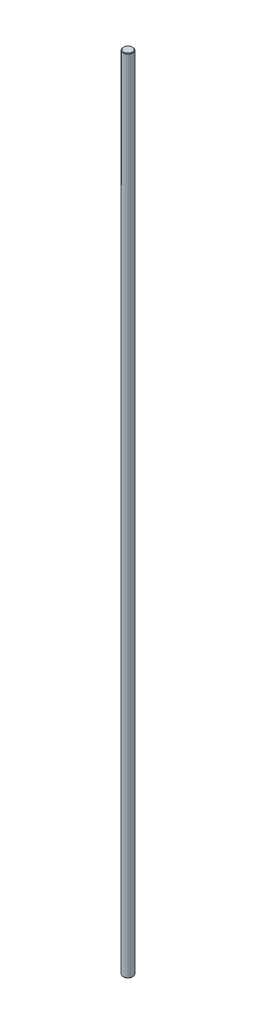
ISO-10303-21;
HEADER;
FILE_DESCRIPTION(('STEP AP214'),'2;1');
FILE_NAME('part.step','',(''),(''),'','','');
FILE_SCHEMA(('AUTOMOTIVE_DESIGN { 1 0 10303 214 1 1 1 1 }'));
ENDSEC;
DATA;
#1=APPLICATION_CONTEXT('core data for automotive mechanical design processes');
#2=APPLICATION_PROTOCOL_DEFINITION('international standard','automotive_design',2000,#1);
#3=PRODUCT_CONTEXT('',#1,'mechanical');
#4=PRODUCT('Part','Part','',(#3));
#5=PRODUCT_RELATED_PRODUCT_CATEGORY('part','',(#4));
#6=PRODUCT_DEFINITION_FORMATION('','',#4);
#7=PRODUCT_DEFINITION_CONTEXT('part definition',#1,'design');
#8=PRODUCT_DEFINITION('design','',#6,#7);
#9=PRODUCT_DEFINITION_SHAPE('','',#8);
#10=(LENGTH_UNIT() NAMED_UNIT(*) SI_UNIT(.MILLI.,.METRE.));
#11=(NAMED_UNIT(*) PLANE_ANGLE_UNIT() SI_UNIT($,.RADIAN.));
#12=(NAMED_UNIT(*) SI_UNIT($,.STERADIAN.) SOLID_ANGLE_UNIT());
#13=UNCERTAINTY_MEASURE_WITH_UNIT(LENGTH_MEASURE(1.E-05),#10,'distance_accuracy_value','');
#14=(GEOMETRIC_REPRESENTATION_CONTEXT(3) GLOBAL_UNCERTAINTY_ASSIGNED_CONTEXT((#13)) GLOBAL_UNIT_ASSIGNED_CONTEXT((#10,
#11,#12)) REPRESENTATION_CONTEXT('',''));
#15=CARTESIAN_POINT('',(0.,0.,0.));
#16=DIRECTION('',(0.,0.,1.));
#17=DIRECTION('',(1.,0.,0.));
#18=AXIS2_PLACEMENT_3D('',#15,#16,#17);
#19=CARTESIAN_POINT('',(0.,411.,0.));
#20=DIRECTION('',(0.,-1.,0.));
#21=DIRECTION('',(0.,0.,-1.));
#22=AXIS2_PLACEMENT_3D('',#19,#20,#21);
#23=CYLINDRICAL_SURFACE('',#22,2.5);
#24=CARTESIAN_POINT('',(0.,0.249999999999972,0.));
#25=DIRECTION('',(0.,1.,0.));
#26=DIRECTION('',(0.,0.,1.));
#27=AXIS2_PLACEMENT_3D('',#24,#25,#26);
#28=CIRCLE('',#27,2.5);
#29=CARTESIAN_POINT('',(0.,0.249999999999972,2.5));
#30=VERTEX_POINT('',#29);
#31=EDGE_CURVE('E42',#30,#30,#28,.T.);
#32=ORIENTED_EDGE('',*,*,#31,.T.);
#33=EDGE_LOOP('',(#32));
#34=FACE_BOUND('',#33,.T.);
#35=CARTESIAN_POINT('',(0.,410.75,0.));
#36=DIRECTION('',(0.,1.,0.));
#37=DIRECTION('',(0.,0.,1.));
#38=AXIS2_PLACEMENT_3D('',#35,#36,#37);
#39=CIRCLE('',#38,2.5);
#40=CARTESIAN_POINT('',(0.,410.75,2.5));
#41=VERTEX_POINT('',#40);
#42=EDGE_CURVE('E46',#41,#41,#39,.F.);
#43=ORIENTED_EDGE('',*,*,#42,.T.);
#44=EDGE_LOOP('',(#43));
#45=FACE_BOUND('',#44,.T.);
#46=ADVANCED_FACE('F31',(#34,#45),#23,.T.);
#47=CARTESIAN_POINT('',(0.,411.,0.));
#48=DIRECTION('',(0.,1.,0.));
#49=DIRECTION('',(0.,0.,1.));
#50=AXIS2_PLACEMENT_3D('',#47,#48,#49);
#51=PLANE('',#50);
#52=CARTESIAN_POINT('',(0.,411.,0.));
#53=DIRECTION('',(0.,1.,0.));
#54=DIRECTION('',(0.,0.,1.));
#55=AXIS2_PLACEMENT_3D('',#52,#53,#54);
#56=CIRCLE('',#55,2.25000000000003);
#57=CARTESIAN_POINT('',(0.,411.,2.25000000000003));
#58=VERTEX_POINT('',#57);
#59=EDGE_CURVE('E10',#58,#58,#56,.T.);
#60=ORIENTED_EDGE('',*,*,#59,.T.);
#61=EDGE_LOOP('',(#60));
#62=FACE_BOUND('',#61,.T.);
#63=ADVANCED_FACE('F62',(#62),#51,.T.);
#64=CARTESIAN_POINT('',(0.,0.,0.));
#65=DIRECTION('',(0.,1.,0.));
#66=DIRECTION('',(0.,0.,1.));
#67=AXIS2_PLACEMENT_3D('',#64,#65,#66);
#68=PLANE('',#67);
#69=CARTESIAN_POINT('',(0.,0.,0.));
#70=DIRECTION('',(0.,1.,0.));
#71=DIRECTION('',(0.,0.,1.));
#72=AXIS2_PLACEMENT_3D('',#69,#70,#71);
#73=CIRCLE('',#72,2.25000000000003);
#74=CARTESIAN_POINT('',(0.,0.,2.25000000000003));
#75=VERTEX_POINT('',#74);
#76=EDGE_CURVE('E38',#75,#75,#73,.F.);
#77=ORIENTED_EDGE('',*,*,#76,.T.);
#78=EDGE_LOOP('',(#77));
#79=FACE_BOUND('',#78,.T.);
#80=ADVANCED_FACE('F59',(#79),#68,.F.);
#81=CARTESIAN_POINT('',(0.,0.249999999999972,0.));
#82=DIRECTION('',(0.,1.,0.));
#83=DIRECTION('',(0.,0.,1.));
#84=AXIS2_PLACEMENT_3D('',#81,#82,#83);
#85=CONICAL_SURFACE('',#84,2.5,0.785398163397445);
#86=ORIENTED_EDGE('',*,*,#76,.F.);
#87=EDGE_LOOP('',(#86));
#88=FACE_BOUND('',#87,.T.);
#89=ORIENTED_EDGE('',*,*,#31,.F.);
#90=EDGE_LOOP('',(#89));
#91=FACE_BOUND('',#90,.T.);
#92=ADVANCED_FACE('F55',(#88,#91),#85,.T.);
#93=CARTESIAN_POINT('',(0.,411.,0.));
#94=DIRECTION('',(0.,-1.,0.));
#95=DIRECTION('',(0.,0.,-1.));
#96=AXIS2_PLACEMENT_3D('',#93,#94,#95);
#97=CONICAL_SURFACE('',#96,2.25000000000003,0.785398163397556);
#98=ORIENTED_EDGE('',*,*,#42,.F.);
#99=EDGE_LOOP('',(#98));
#100=FACE_BOUND('',#99,.T.);
#101=ORIENTED_EDGE('',*,*,#59,.F.);
#102=EDGE_LOOP('',(#101));
#103=FACE_BOUND('',#102,.T.);
#104=ADVANCED_FACE('F33',(#100,#103),#97,.T.);
#105=CLOSED_SHELL('',(#46,#63,#80,#92,#104));
#106=MANIFOLD_SOLID_BREP('B2',#105);
#107=ADVANCED_BREP_SHAPE_REPRESENTATION('',(#18,#106),#14);
#108=SHAPE_DEFINITION_REPRESENTATION(#9,#107);
ENDSEC;
END-ISO-10303-21;
